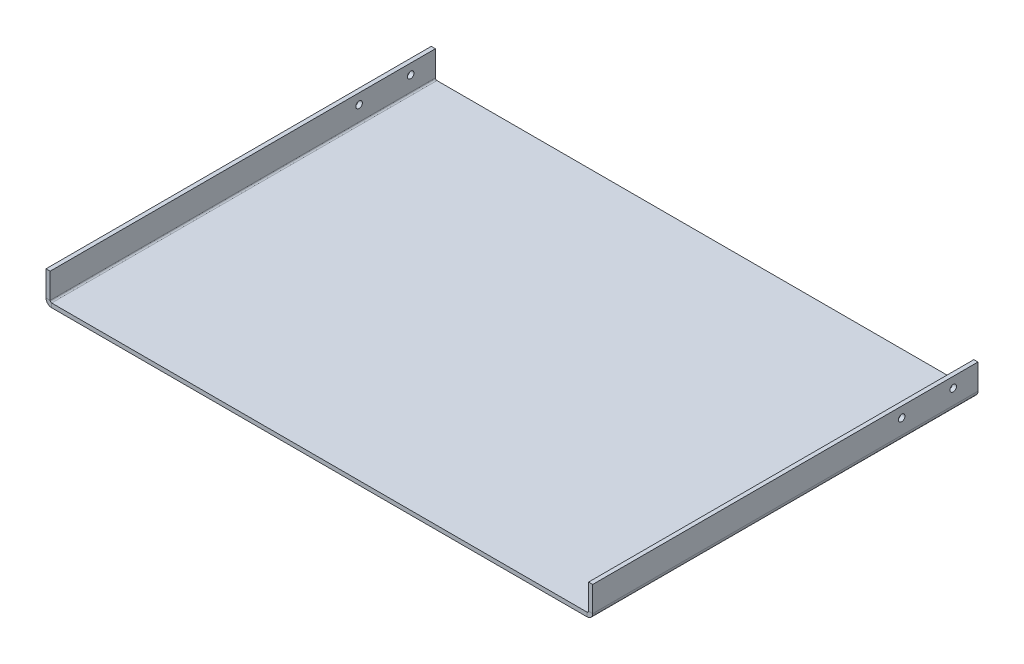
ISO-10303-21;
HEADER;
FILE_DESCRIPTION(('STEP AP214'),'2;1');
FILE_NAME('part.step','',(''),(''),'','','');
FILE_SCHEMA(('AUTOMOTIVE_DESIGN { 1 0 10303 214 1 1 1 1 }'));
ENDSEC;
DATA;
#1=APPLICATION_CONTEXT('core data for automotive mechanical design processes');
#2=APPLICATION_PROTOCOL_DEFINITION('international standard','automotive_design',2000,#1);
#3=PRODUCT_CONTEXT('',#1,'mechanical');
#4=PRODUCT('Part','Part','',(#3));
#5=PRODUCT_RELATED_PRODUCT_CATEGORY('part','',(#4));
#6=PRODUCT_DEFINITION_FORMATION('','',#4);
#7=PRODUCT_DEFINITION_CONTEXT('part definition',#1,'design');
#8=PRODUCT_DEFINITION('design','',#6,#7);
#9=PRODUCT_DEFINITION_SHAPE('','',#8);
#10=(LENGTH_UNIT() NAMED_UNIT(*) SI_UNIT(.MILLI.,.METRE.));
#11=(NAMED_UNIT(*) PLANE_ANGLE_UNIT() SI_UNIT($,.RADIAN.));
#12=(NAMED_UNIT(*) SI_UNIT($,.STERADIAN.) SOLID_ANGLE_UNIT());
#13=UNCERTAINTY_MEASURE_WITH_UNIT(LENGTH_MEASURE(1.E-05),#10,'distance_accuracy_value','');
#14=(GEOMETRIC_REPRESENTATION_CONTEXT(3) GLOBAL_UNCERTAINTY_ASSIGNED_CONTEXT((#13)) GLOBAL_UNIT_ASSIGNED_CONTEXT((#10,
#11,#12)) REPRESENTATION_CONTEXT('',''));
#15=CARTESIAN_POINT('',(0.,0.,0.));
#16=DIRECTION('',(0.,0.,1.));
#17=DIRECTION('',(1.,0.,0.));
#18=AXIS2_PLACEMENT_3D('',#15,#16,#17);
#19=CARTESIAN_POINT('',(0.,-2.,0.));
#20=DIRECTION('',(0.,1.,0.));
#21=DIRECTION('',(0.,0.,1.));
#22=AXIS2_PLACEMENT_3D('',#19,#20,#21);
#23=PLANE('',#22);
#24=DIRECTION('',(0.,0.,-1.));
#25=VECTOR('',#24,1.);
#26=CARTESIAN_POINT('',(38.7674016009762,-2.00000000000001,-31.5017181838341));
#27=LINE('',#26,#25);
#28=CARTESIAN_POINT('',(38.7674016009762,-2.00000000000001,-31.501718183834));
#29=VERTEX_POINT('',#28);
#30=CARTESIAN_POINT('',(38.7674016009762,-2.,155.248281816166));
#31=VERTEX_POINT('',#30);
#32=EDGE_CURVE('E210',#29,#31,#27,.F.);
#33=ORIENTED_EDGE('',*,*,#32,.T.);
#34=DIRECTION('',(1.,0.,0.));
#35=VECTOR('',#34,1.);
#36=CARTESIAN_POINT('',(-223.495998399024,-2.,155.248281816166));
#37=LINE('',#36,#35);
#38=CARTESIAN_POINT('',(-220.759398399024,-2.00000000000002,155.248281816166));
#39=VERTEX_POINT('',#38);
#40=EDGE_CURVE('E86',#39,#31,#37,.T.);
#41=ORIENTED_EDGE('',*,*,#40,.F.);
#42=DIRECTION('',(0.,0.,1.));
#43=VECTOR('',#42,1.);
#44=CARTESIAN_POINT('',(-220.759398399024,-2.00000000000002,155.248281816166));
#45=LINE('',#44,#43);
#46=CARTESIAN_POINT('',(-220.759398399024,-2.,-31.5017181838341));
#47=VERTEX_POINT('',#46);
#48=EDGE_CURVE('E263',#39,#47,#45,.F.);
#49=ORIENTED_EDGE('',*,*,#48,.T.);
#50=DIRECTION('',(-1.,0.,0.));
#51=VECTOR('',#50,1.);
#52=CARTESIAN_POINT('',(-223.495998399024,-2.,-31.5017181838341));
#53=LINE('',#52,#51);
#54=EDGE_CURVE('E13',#29,#47,#53,.T.);
#55=ORIENTED_EDGE('',*,*,#54,.F.);
#56=EDGE_LOOP('',(#33,#41,#49,#55));
#57=FACE_BOUND('',#56,.T.);
#58=ADVANCED_FACE('F77',(#57),#23,.F.);
#59=CARTESIAN_POINT('',(0.,0.,0.));
#60=DIRECTION('',(0.,1.,0.));
#61=DIRECTION('',(0.,0.,1.));
#62=AXIS2_PLACEMENT_3D('',#59,#60,#61);
#63=PLANE('',#62);
#64=DIRECTION('',(1.,0.,0.));
#65=VECTOR('',#64,1.);
#66=CARTESIAN_POINT('',(-223.495998399024,0.,155.248281816166));
#67=LINE('',#66,#65);
#68=CARTESIAN_POINT('',(-220.759398399024,0.,155.248281816166));
#69=VERTEX_POINT('',#68);
#70=CARTESIAN_POINT('',(38.7674016009762,0.,155.248281816166));
#71=VERTEX_POINT('',#70);
#72=EDGE_CURVE('E281',#69,#71,#67,.T.);
#73=ORIENTED_EDGE('',*,*,#72,.T.);
#74=DIRECTION('',(0.,0.,-1.));
#75=VECTOR('',#74,1.);
#76=CARTESIAN_POINT('',(38.7674016009762,0.,-31.5017181838341));
#77=LINE('',#76,#75);
#78=CARTESIAN_POINT('',(38.7674016009762,0.,-31.501718183834));
#79=VERTEX_POINT('',#78);
#80=EDGE_CURVE('E222',#79,#71,#77,.F.);
#81=ORIENTED_EDGE('',*,*,#80,.F.);
#82=DIRECTION('',(-1.,0.,0.));
#83=VECTOR('',#82,1.);
#84=CARTESIAN_POINT('',(-223.495998399024,0.,-31.5017181838341));
#85=LINE('',#84,#83);
#86=CARTESIAN_POINT('',(-220.759398399024,0.,-31.5017181838341));
#87=VERTEX_POINT('',#86);
#88=EDGE_CURVE('E285',#79,#87,#85,.T.);
#89=ORIENTED_EDGE('',*,*,#88,.T.);
#90=DIRECTION('',(0.,0.,1.));
#91=VECTOR('',#90,1.);
#92=CARTESIAN_POINT('',(-220.759398399024,0.,155.248281816166));
#93=LINE('',#92,#91);
#94=EDGE_CURVE('E94',#69,#87,#93,.F.);
#95=ORIENTED_EDGE('',*,*,#94,.F.);
#96=EDGE_LOOP('',(#73,#81,#89,#95));
#97=FACE_BOUND('',#96,.T.);
#98=ADVANCED_FACE('F337',(#97),#63,.T.);
#99=CARTESIAN_POINT('',(-223.495998399024,-2.,-31.5017181838341));
#100=DIRECTION('',(0.,0.,-1.));
#101=DIRECTION('',(-1.,0.,0.));
#102=AXIS2_PLACEMENT_3D('',#99,#100,#101);
#103=PLANE('',#102);
#104=ORIENTED_EDGE('',*,*,#88,.F.);
#105=DIRECTION('',(0.,-1.,0.));
#106=VECTOR('',#105,1.);
#107=CARTESIAN_POINT('',(38.7674016009762,0.,-31.501718183834));
#108=LINE('',#107,#106);
#109=EDGE_CURVE('E216',#79,#29,#108,.T.);
#110=ORIENTED_EDGE('',*,*,#109,.T.);
#111=ORIENTED_EDGE('',*,*,#54,.T.);
#112=DIRECTION('',(0.,-1.,0.));
#113=VECTOR('',#112,1.);
#114=CARTESIAN_POINT('',(-220.759398399024,0.,-31.5017181838341));
#115=LINE('',#114,#113);
#116=EDGE_CURVE('E278',#87,#47,#115,.T.);
#117=ORIENTED_EDGE('',*,*,#116,.F.);
#118=EDGE_LOOP('',(#104,#110,#111,#117));
#119=FACE_BOUND('',#118,.T.);
#120=ADVANCED_FACE('F343',(#119),#103,.T.);
#121=CARTESIAN_POINT('',(-223.495998399024,-2.,155.248281816166));
#122=DIRECTION('',(0.,0.,1.));
#123=DIRECTION('',(1.,0.,0.));
#124=AXIS2_PLACEMENT_3D('',#121,#122,#123);
#125=PLANE('',#124);
#126=DIRECTION('',(0.,-1.,0.));
#127=VECTOR('',#126,1.);
#128=CARTESIAN_POINT('',(38.7674016009762,0.,155.248281816166));
#129=LINE('',#128,#127);
#130=EDGE_CURVE('E228',#71,#31,#129,.T.);
#131=ORIENTED_EDGE('',*,*,#130,.F.);
#132=ORIENTED_EDGE('',*,*,#72,.F.);
#133=DIRECTION('',(0.,-1.,0.));
#134=VECTOR('',#133,1.);
#135=CARTESIAN_POINT('',(-220.759398399024,0.,155.248281816166));
#136=LINE('',#135,#134);
#137=EDGE_CURVE('E269',#69,#39,#136,.T.);
#138=ORIENTED_EDGE('',*,*,#137,.T.);
#139=ORIENTED_EDGE('',*,*,#40,.T.);
#140=EDGE_LOOP('',(#131,#132,#138,#139));
#141=FACE_BOUND('',#140,.T.);
#142=ADVANCED_FACE('F79',(#141),#125,.T.);
#143=CARTESIAN_POINT('',(-220.759398399024,0.736600000000007,-31.5017181838341));
#144=DIRECTION('',(0.,0.,-1.));
#145=DIRECTION('',(-1.,0.,0.));
#146=AXIS2_PLACEMENT_3D('',#143,#144,#145);
#147=PLANE('',#146);
#148=DIRECTION('',(1.,0.,0.));
#149=VECTOR('',#148,1.);
#150=CARTESIAN_POINT('',(-223.495998399024,0.736599999999995,-31.5017181838341));
#151=LINE('',#150,#149);
#152=CARTESIAN_POINT('',(-221.495998399024,0.736600000000004,-31.5017181838341));
#153=VERTEX_POINT('',#152);
#154=CARTESIAN_POINT('',(-223.495998399024,0.736599999999995,-31.5017181838341));
#155=VERTEX_POINT('',#154);
#156=EDGE_CURVE('E231',#153,#155,#151,.F.);
#157=ORIENTED_EDGE('',*,*,#156,.F.);
#158=CARTESIAN_POINT('',(-220.759398399024,0.736600000000007,-31.5017181838341));
#159=DIRECTION('',(0.,0.,1.));
#160=DIRECTION('',(1.,0.,0.));
#161=AXIS2_PLACEMENT_3D('',#158,#159,#160);
#162=CIRCLE('',#161,0.736600000000032);
#163=EDGE_CURVE('E272',#87,#153,#162,.F.);
#164=ORIENTED_EDGE('',*,*,#163,.F.);
#165=ORIENTED_EDGE('',*,*,#116,.T.);
#166=CARTESIAN_POINT('',(-220.759398399024,0.736600000000007,-31.5017181838341));
#167=DIRECTION('',(0.,0.,1.));
#168=DIRECTION('',(1.,0.,0.));
#169=AXIS2_PLACEMENT_3D('',#166,#167,#168);
#170=CIRCLE('',#169,2.73660000000003);
#171=EDGE_CURVE('E265',#47,#155,#170,.F.);
#172=ORIENTED_EDGE('',*,*,#171,.T.);
#173=EDGE_LOOP('',(#157,#164,#165,#172));
#174=FACE_BOUND('',#173,.T.);
#175=ADVANCED_FACE('F352',(#174),#147,.T.);
#176=CARTESIAN_POINT('',(-220.759398399024,0.736600000000007,155.248281816166));
#177=DIRECTION('',(0.,0.,-1.));
#178=DIRECTION('',(-1.,0.,0.));
#179=AXIS2_PLACEMENT_3D('',#176,#177,#178);
#180=PLANE('',#179);
#181=CARTESIAN_POINT('',(-220.759398399024,0.736600000000007,155.248281816166));
#182=DIRECTION('',(0.,0.,1.));
#183=DIRECTION('',(1.,0.,0.));
#184=AXIS2_PLACEMENT_3D('',#181,#182,#183);
#185=CIRCLE('',#184,0.736600000000032);
#186=CARTESIAN_POINT('',(-221.495998399024,0.736600000000004,155.248281816166));
#187=VERTEX_POINT('',#186);
#188=EDGE_CURVE('E236',#187,#69,#185,.T.);
#189=ORIENTED_EDGE('',*,*,#188,.F.);
#190=DIRECTION('',(1.,0.,0.));
#191=VECTOR('',#190,1.);
#192=CARTESIAN_POINT('',(-221.495998399024,0.736600000000004,155.248281816166));
#193=LINE('',#192,#191);
#194=CARTESIAN_POINT('',(-223.495998399024,0.736599999999995,155.248281816166));
#195=VERTEX_POINT('',#194);
#196=EDGE_CURVE('E256',#187,#195,#193,.F.);
#197=ORIENTED_EDGE('',*,*,#196,.T.);
#198=CARTESIAN_POINT('',(-220.759398399024,0.736600000000007,155.248281816166));
#199=DIRECTION('',(0.,0.,1.));
#200=DIRECTION('',(1.,0.,0.));
#201=AXIS2_PLACEMENT_3D('',#198,#199,#200);
#202=CIRCLE('',#201,2.73660000000003);
#203=EDGE_CURVE('E266',#195,#39,#202,.T.);
#204=ORIENTED_EDGE('',*,*,#203,.T.);
#205=ORIENTED_EDGE('',*,*,#137,.F.);
#206=EDGE_LOOP('',(#189,#197,#204,#205));
#207=FACE_BOUND('',#206,.T.);
#208=ADVANCED_FACE('F346',(#207),#180,.F.);
#209=CARTESIAN_POINT('',(-220.759398399024,0.736600000000007,155.248281816166));
#210=DIRECTION('',(0.,0.,1.));
#211=DIRECTION('',(-1.,0.,0.));
#212=AXIS2_PLACEMENT_3D('',#209,#210,#211);
#213=CYLINDRICAL_SURFACE('',#212,2.73660000000003);
#214=ORIENTED_EDGE('',*,*,#48,.F.);
#215=ORIENTED_EDGE('',*,*,#203,.F.);
#216=DIRECTION('',(0.,0.,1.));
#217=VECTOR('',#216,1.);
#218=CARTESIAN_POINT('',(-223.495998399024,0.736599999999995,-31.5017181838341));
#219=LINE('',#218,#217);
#220=EDGE_CURVE('E254',#195,#155,#219,.F.);
#221=ORIENTED_EDGE('',*,*,#220,.T.);
#222=ORIENTED_EDGE('',*,*,#171,.F.);
#223=EDGE_LOOP('',(#214,#215,#221,#222));
#224=FACE_BOUND('',#223,.T.);
#225=ADVANCED_FACE('F367',(#224),#213,.T.);
#226=CARTESIAN_POINT('',(-220.759398399024,0.736600000000007,155.248281816166));
#227=DIRECTION('',(0.,0.,1.));
#228=DIRECTION('',(-1.,0.,0.));
#229=AXIS2_PLACEMENT_3D('',#226,#227,#228);
#230=CYLINDRICAL_SURFACE('',#229,0.736600000000032);
#231=ORIENTED_EDGE('',*,*,#94,.T.);
#232=ORIENTED_EDGE('',*,*,#163,.T.);
#233=DIRECTION('',(0.,0.,1.));
#234=VECTOR('',#233,1.);
#235=CARTESIAN_POINT('',(-221.495998399024,0.736600000000004,-31.5017181838341));
#236=LINE('',#235,#234);
#237=EDGE_CURVE('E259',#153,#187,#236,.T.);
#238=ORIENTED_EDGE('',*,*,#237,.T.);
#239=ORIENTED_EDGE('',*,*,#188,.T.);
#240=EDGE_LOOP('',(#231,#232,#238,#239));
#241=FACE_BOUND('',#240,.T.);
#242=ADVANCED_FACE('F390',(#241),#230,.F.);
#243=CARTESIAN_POINT('',(-223.495998399024,13.,155.248281816166));
#244=DIRECTION('',(0.,0.,-1.));
#245=DIRECTION('',(-1.,0.,0.));
#246=AXIS2_PLACEMENT_3D('',#243,#244,#245);
#247=PLANE('',#246);
#248=ORIENTED_EDGE('',*,*,#196,.F.);
#249=DIRECTION('',(0.,-1.,0.));
#250=VECTOR('',#249,1.);
#251=CARTESIAN_POINT('',(-221.495998399024,13.,155.248281816166));
#252=LINE('',#251,#250);
#253=CARTESIAN_POINT('',(-221.495998399024,13.,155.248281816166));
#254=VERTEX_POINT('',#253);
#255=EDGE_CURVE('E252',#187,#254,#252,.F.);
#256=ORIENTED_EDGE('',*,*,#255,.T.);
#257=DIRECTION('',(1.,0.,0.));
#258=VECTOR('',#257,1.);
#259=CARTESIAN_POINT('',(-223.495998399024,13.,155.248281816166));
#260=LINE('',#259,#258);
#261=CARTESIAN_POINT('',(-223.495998399024,13.,155.248281816166));
#262=VERTEX_POINT('',#261);
#263=EDGE_CURVE('E233',#262,#254,#260,.T.);
#264=ORIENTED_EDGE('',*,*,#263,.F.);
#265=DIRECTION('',(0.,1.,0.));
#266=VECTOR('',#265,1.);
#267=CARTESIAN_POINT('',(-223.495998399024,-9.6133066780916E-13,155.248281816166));
#268=LINE('',#267,#266);
#269=EDGE_CURVE('E245',#195,#262,#268,.T.);
#270=ORIENTED_EDGE('',*,*,#269,.F.);
#271=EDGE_LOOP('',(#248,#256,#264,#270));
#272=FACE_BOUND('',#271,.T.);
#273=ADVANCED_FACE('F377',(#272),#247,.F.);
#274=CARTESIAN_POINT('',(-223.495998399024,0.,-31.5017181838341));
#275=DIRECTION('',(0.,0.,1.));
#276=DIRECTION('',(1.,0.,0.));
#277=AXIS2_PLACEMENT_3D('',#274,#275,#276);
#278=PLANE('',#277);
#279=ORIENTED_EDGE('',*,*,#156,.T.);
#280=DIRECTION('',(0.,-1.,0.));
#281=VECTOR('',#280,1.);
#282=CARTESIAN_POINT('',(-223.495998399024,-9.6133066780916E-13,-31.5017181838341));
#283=LINE('',#282,#281);
#284=CARTESIAN_POINT('',(-223.495998399024,13.,-31.5017181838341));
#285=VERTEX_POINT('',#284);
#286=EDGE_CURVE('E240',#285,#155,#283,.T.);
#287=ORIENTED_EDGE('',*,*,#286,.F.);
#288=DIRECTION('',(1.,0.,0.));
#289=VECTOR('',#288,1.);
#290=CARTESIAN_POINT('',(-223.495998399024,13.,-31.5017181838341));
#291=LINE('',#290,#289);
#292=CARTESIAN_POINT('',(-221.495998399024,13.,-31.5017181838341));
#293=VERTEX_POINT('',#292);
#294=EDGE_CURVE('E237',#285,#293,#291,.T.);
#295=ORIENTED_EDGE('',*,*,#294,.T.);
#296=DIRECTION('',(0.,1.,0.));
#297=VECTOR('',#296,1.);
#298=CARTESIAN_POINT('',(-221.495998399024,0.,-31.5017181838341));
#299=LINE('',#298,#297);
#300=EDGE_CURVE('E247',#293,#153,#299,.F.);
#301=ORIENTED_EDGE('',*,*,#300,.T.);
#302=EDGE_LOOP('',(#279,#287,#295,#301));
#303=FACE_BOUND('',#302,.T.);
#304=ADVANCED_FACE('F385',(#303),#278,.F.);
#305=CARTESIAN_POINT('',(-223.495998399024,-9.6133066780916E-13,0.));
#306=DIRECTION('',(1.,0.,0.));
#307=DIRECTION('',(0.,1.,0.));
#308=AXIS2_PLACEMENT_3D('',#305,#306,#307);
#309=PLANE('',#308);
#310=CARTESIAN_POINT('',(-223.495998399024,8.,-19.5017181838341));
#311=DIRECTION('',(-1.,0.,0.));
#312=DIRECTION('',(0.,-1.,0.));
#313=AXIS2_PLACEMENT_3D('',#310,#311,#312);
#314=CIRCLE('',#313,1.6);
#315=CARTESIAN_POINT('',(-223.495998399024,6.4,-19.5017181838341));
#316=VERTEX_POINT('',#315);
#317=EDGE_CURVE('E291',#316,#316,#314,.T.);
#318=ORIENTED_EDGE('',*,*,#317,.F.);
#319=EDGE_LOOP('',(#318));
#320=FACE_BOUND('',#319,.T.);
#321=CARTESIAN_POINT('',(-223.495998399024,8.,5.49828181616595));
#322=DIRECTION('',(-1.,0.,0.));
#323=DIRECTION('',(0.,-1.,0.));
#324=AXIS2_PLACEMENT_3D('',#321,#322,#323);
#325=CIRCLE('',#324,1.6);
#326=CARTESIAN_POINT('',(-223.495998399024,6.4,5.49828181616595));
#327=VERTEX_POINT('',#326);
#328=EDGE_CURVE('E298',#327,#327,#325,.T.);
#329=ORIENTED_EDGE('',*,*,#328,.F.);
#330=EDGE_LOOP('',(#329));
#331=FACE_BOUND('',#330,.T.);
#332=ORIENTED_EDGE('',*,*,#220,.F.);
#333=ORIENTED_EDGE('',*,*,#269,.T.);
#334=DIRECTION('',(0.,0.,-1.));
#335=VECTOR('',#334,1.);
#336=CARTESIAN_POINT('',(-223.495998399024,13.,0.));
#337=LINE('',#336,#335);
#338=EDGE_CURVE('E243',#262,#285,#337,.T.);
#339=ORIENTED_EDGE('',*,*,#338,.T.);
#340=ORIENTED_EDGE('',*,*,#286,.T.);
#341=EDGE_LOOP('',(#332,#333,#339,#340));
#342=FACE_BOUND('',#341,.T.);
#343=ADVANCED_FACE('F374',(#320,#331,#342),#309,.F.);
#344=CARTESIAN_POINT('',(-221.495998399024,-9.54347705131474E-13,0.));
#345=DIRECTION('',(1.,0.,0.));
#346=DIRECTION('',(0.,1.,0.));
#347=AXIS2_PLACEMENT_3D('',#344,#345,#346);
#348=PLANE('',#347);
#349=CARTESIAN_POINT('',(-221.495998399024,8.00000000000001,-19.5017181838341));
#350=DIRECTION('',(1.,0.,0.));
#351=DIRECTION('',(0.,1.,0.));
#352=AXIS2_PLACEMENT_3D('',#349,#350,#351);
#353=CIRCLE('',#352,1.6);
#354=CARTESIAN_POINT('',(-221.495998399024,9.60000000000001,-19.5017181838341));
#355=VERTEX_POINT('',#354);
#356=EDGE_CURVE('E209',#355,#355,#353,.T.);
#357=ORIENTED_EDGE('',*,*,#356,.F.);
#358=EDGE_LOOP('',(#357));
#359=FACE_BOUND('',#358,.T.);
#360=CARTESIAN_POINT('',(-221.495998399024,8.00000000000001,5.49828181616595));
#361=DIRECTION('',(1.,0.,0.));
#362=DIRECTION('',(0.,1.,0.));
#363=AXIS2_PLACEMENT_3D('',#360,#361,#362);
#364=CIRCLE('',#363,1.6);
#365=CARTESIAN_POINT('',(-221.495998399024,9.60000000000001,5.49828181616595));
#366=VERTEX_POINT('',#365);
#367=EDGE_CURVE('E295',#366,#366,#364,.T.);
#368=ORIENTED_EDGE('',*,*,#367,.F.);
#369=EDGE_LOOP('',(#368));
#370=FACE_BOUND('',#369,.T.);
#371=ORIENTED_EDGE('',*,*,#255,.F.);
#372=ORIENTED_EDGE('',*,*,#237,.F.);
#373=ORIENTED_EDGE('',*,*,#300,.F.);
#374=DIRECTION('',(0.,0.,1.));
#375=VECTOR('',#374,1.);
#376=CARTESIAN_POINT('',(-221.495998399024,13.,-31.5017181838341));
#377=LINE('',#376,#375);
#378=EDGE_CURVE('E250',#254,#293,#377,.F.);
#379=ORIENTED_EDGE('',*,*,#378,.F.);
#380=EDGE_LOOP('',(#371,#372,#373,#379));
#381=FACE_BOUND('',#380,.T.);
#382=ADVANCED_FACE('F392',(#359,#370,#381),#348,.T.);
#383=CARTESIAN_POINT('',(-223.495998399024,13.,-31.5017181838341));
#384=DIRECTION('',(0.,-1.,0.));
#385=DIRECTION('',(1.,0.,0.));
#386=AXIS2_PLACEMENT_3D('',#383,#384,#385);
#387=PLANE('',#386);
#388=ORIENTED_EDGE('',*,*,#378,.T.);
#389=ORIENTED_EDGE('',*,*,#294,.F.);
#390=ORIENTED_EDGE('',*,*,#338,.F.);
#391=ORIENTED_EDGE('',*,*,#263,.T.);
#392=EDGE_LOOP('',(#388,#389,#390,#391));
#393=FACE_BOUND('',#392,.T.);
#394=ADVANCED_FACE('F382',(#393),#387,.F.);
#395=CARTESIAN_POINT('',(38.7674016009762,0.7366,155.248281816166));
#396=DIRECTION('',(0.,0.,1.));
#397=DIRECTION('',(1.,0.,0.));
#398=AXIS2_PLACEMENT_3D('',#395,#396,#397);
#399=PLANE('',#398);
#400=DIRECTION('',(-1.,0.,0.));
#401=VECTOR('',#400,1.);
#402=CARTESIAN_POINT('',(41.5040016009762,0.736599999999989,155.248281816166));
#403=LINE('',#402,#401);
#404=CARTESIAN_POINT('',(39.5040016009762,0.736599999999997,155.248281816166));
#405=VERTEX_POINT('',#404);
#406=CARTESIAN_POINT('',(41.5040016009762,0.736599999999989,155.248281816166));
#407=VERTEX_POINT('',#406);
#408=EDGE_CURVE('E192',#405,#407,#403,.F.);
#409=ORIENTED_EDGE('',*,*,#408,.F.);
#410=CARTESIAN_POINT('',(38.7674016009762,0.7366,155.248281816166));
#411=DIRECTION('',(0.,0.,-1.));
#412=DIRECTION('',(-1.,0.,0.));
#413=AXIS2_PLACEMENT_3D('',#410,#411,#412);
#414=CIRCLE('',#413,0.736600000000011);
#415=EDGE_CURVE('E219',#71,#405,#414,.F.);
#416=ORIENTED_EDGE('',*,*,#415,.F.);
#417=ORIENTED_EDGE('',*,*,#130,.T.);
#418=CARTESIAN_POINT('',(38.7674016009762,0.7366,155.248281816166));
#419=DIRECTION('',(0.,0.,-1.));
#420=DIRECTION('',(-1.,0.,0.));
#421=AXIS2_PLACEMENT_3D('',#418,#419,#420);
#422=CIRCLE('',#421,2.73660000000001);
#423=EDGE_CURVE('E212',#31,#407,#422,.F.);
#424=ORIENTED_EDGE('',*,*,#423,.T.);
#425=EDGE_LOOP('',(#409,#416,#417,#424));
#426=FACE_BOUND('',#425,.T.);
#427=ADVANCED_FACE('F357',(#426),#399,.T.);
#428=CARTESIAN_POINT('',(38.7674016009762,0.7366,-31.501718183834));
#429=DIRECTION('',(0.,0.,1.));
#430=DIRECTION('',(1.,0.,0.));
#431=AXIS2_PLACEMENT_3D('',#428,#429,#430);
#432=PLANE('',#431);
#433=CARTESIAN_POINT('',(38.7674016009762,0.7366,-31.501718183834));
#434=DIRECTION('',(0.,0.,-1.));
#435=DIRECTION('',(-1.,0.,0.));
#436=AXIS2_PLACEMENT_3D('',#433,#434,#435);
#437=CIRCLE('',#436,0.736600000000011);
#438=CARTESIAN_POINT('',(39.5040016009762,0.736599999999997,-31.501718183834));
#439=VERTEX_POINT('',#438);
#440=EDGE_CURVE('E225',#439,#79,#437,.T.);
#441=ORIENTED_EDGE('',*,*,#440,.F.);
#442=DIRECTION('',(-1.,0.,0.));
#443=VECTOR('',#442,1.);
#444=CARTESIAN_POINT('',(39.5040016009762,0.736599999999997,-31.501718183834));
#445=LINE('',#444,#443);
#446=CARTESIAN_POINT('',(41.5040016009762,0.736599999999989,-31.5017181838341));
#447=VERTEX_POINT('',#446);
#448=EDGE_CURVE('E203',#439,#447,#445,.F.);
#449=ORIENTED_EDGE('',*,*,#448,.T.);
#450=CARTESIAN_POINT('',(38.7674016009762,0.7366,-31.501718183834));
#451=DIRECTION('',(0.,0.,-1.));
#452=DIRECTION('',(-1.,0.,0.));
#453=AXIS2_PLACEMENT_3D('',#450,#451,#452);
#454=CIRCLE('',#453,2.73660000000001);
#455=EDGE_CURVE('E213',#447,#29,#454,.T.);
#456=ORIENTED_EDGE('',*,*,#455,.T.);
#457=ORIENTED_EDGE('',*,*,#109,.F.);
#458=EDGE_LOOP('',(#441,#449,#456,#457));
#459=FACE_BOUND('',#458,.T.);
#460=ADVANCED_FACE('F324',(#459),#432,.F.);
#461=CARTESIAN_POINT('',(38.7674016009762,0.7366,-31.5017181838341));
#462=DIRECTION('',(0.,0.,-1.));
#463=DIRECTION('',(1.,0.,0.));
#464=AXIS2_PLACEMENT_3D('',#461,#462,#463);
#465=CYLINDRICAL_SURFACE('',#464,2.73660000000001);
#466=ORIENTED_EDGE('',*,*,#32,.F.);
#467=ORIENTED_EDGE('',*,*,#455,.F.);
#468=DIRECTION('',(0.,0.,-1.));
#469=VECTOR('',#468,1.);
#470=CARTESIAN_POINT('',(41.5040016009762,0.736599999999989,155.248281816166));
#471=LINE('',#470,#469);
#472=EDGE_CURVE('E201',#447,#407,#471,.F.);
#473=ORIENTED_EDGE('',*,*,#472,.T.);
#474=ORIENTED_EDGE('',*,*,#423,.F.);
#475=EDGE_LOOP('',(#466,#467,#473,#474));
#476=FACE_BOUND('',#475,.T.);
#477=ADVANCED_FACE('F360',(#476),#465,.T.);
#478=CARTESIAN_POINT('',(38.7674016009762,0.7366,-31.5017181838341));
#479=DIRECTION('',(0.,0.,-1.));
#480=DIRECTION('',(1.,0.,0.));
#481=AXIS2_PLACEMENT_3D('',#478,#479,#480);
#482=CYLINDRICAL_SURFACE('',#481,0.736600000000011);
#483=ORIENTED_EDGE('',*,*,#80,.T.);
#484=ORIENTED_EDGE('',*,*,#415,.T.);
#485=DIRECTION('',(0.,0.,-1.));
#486=VECTOR('',#485,1.);
#487=CARTESIAN_POINT('',(39.5040016009762,0.736599999999997,155.248281816166));
#488=LINE('',#487,#486);
#489=EDGE_CURVE('E206',#405,#439,#488,.T.);
#490=ORIENTED_EDGE('',*,*,#489,.T.);
#491=ORIENTED_EDGE('',*,*,#440,.T.);
#492=EDGE_LOOP('',(#483,#484,#490,#491));
#493=FACE_BOUND('',#492,.T.);
#494=ADVANCED_FACE('F319',(#493),#482,.F.);
#495=CARTESIAN_POINT('',(41.5040016009762,0.,155.248281816166));
#496=DIRECTION('',(0.,0.,-1.));
#497=DIRECTION('',(-1.,0.,0.));
#498=AXIS2_PLACEMENT_3D('',#495,#496,#497);
#499=PLANE('',#498);
#500=ORIENTED_EDGE('',*,*,#408,.T.);
#501=DIRECTION('',(0.,-1.,0.));
#502=VECTOR('',#501,1.);
#503=CARTESIAN_POINT('',(41.5040016009762,-1.62055504668255E-13,155.248281816166));
#504=LINE('',#503,#502);
#505=CARTESIAN_POINT('',(41.5040016009763,13.,155.248281816166));
#506=VERTEX_POINT('',#505);
#507=EDGE_CURVE('E173',#506,#407,#504,.T.);
#508=ORIENTED_EDGE('',*,*,#507,.F.);
#509=DIRECTION('',(-1.,0.,0.));
#510=VECTOR('',#509,1.);
#511=CARTESIAN_POINT('',(41.5040016009763,13.,155.248281816166));
#512=LINE('',#511,#510);
#513=CARTESIAN_POINT('',(39.5040016009763,13.,155.248281816166));
#514=VERTEX_POINT('',#513);
#515=EDGE_CURVE('E179',#506,#514,#512,.T.);
#516=ORIENTED_EDGE('',*,*,#515,.T.);
#517=DIRECTION('',(0.,1.,0.));
#518=VECTOR('',#517,1.);
#519=CARTESIAN_POINT('',(39.5040016009762,0.,155.248281816166));
#520=LINE('',#519,#518);
#521=EDGE_CURVE('E199',#514,#405,#520,.F.);
#522=ORIENTED_EDGE('',*,*,#521,.T.);
#523=EDGE_LOOP('',(#500,#508,#516,#522));
#524=FACE_BOUND('',#523,.T.);
#525=ADVANCED_FACE('F191',(#524),#499,.F.);
#526=CARTESIAN_POINT('',(41.5040016009762,13.,-31.5017181838341));
#527=DIRECTION('',(0.,0.,1.));
#528=DIRECTION('',(0.,-1.,0.));
#529=AXIS2_PLACEMENT_3D('',#526,#527,#528);
#530=PLANE('',#529);
#531=ORIENTED_EDGE('',*,*,#448,.F.);
#532=DIRECTION('',(0.,-1.,0.));
#533=VECTOR('',#532,1.);
#534=CARTESIAN_POINT('',(39.5040016009762,13.,-31.5017181838341));
#535=LINE('',#534,#533);
#536=CARTESIAN_POINT('',(39.5040016009762,13.,-31.501718183834));
#537=VERTEX_POINT('',#536);
#538=EDGE_CURVE('E195',#439,#537,#535,.F.);
#539=ORIENTED_EDGE('',*,*,#538,.T.);
#540=DIRECTION('',(-1.,0.,0.));
#541=VECTOR('',#540,1.);
#542=CARTESIAN_POINT('',(41.5040016009762,13.,-31.501718183834));
#543=LINE('',#542,#541);
#544=CARTESIAN_POINT('',(41.5040016009762,13.,-31.501718183834));
#545=VERTEX_POINT('',#544);
#546=EDGE_CURVE('E188',#545,#537,#543,.T.);
#547=ORIENTED_EDGE('',*,*,#546,.F.);
#548=DIRECTION('',(0.,1.,0.));
#549=VECTOR('',#548,1.);
#550=CARTESIAN_POINT('',(41.5040016009762,-1.45241113878377E-13,-31.5017181838341));
#551=LINE('',#550,#549);
#552=EDGE_CURVE('E175',#447,#545,#551,.T.);
#553=ORIENTED_EDGE('',*,*,#552,.F.);
#554=EDGE_LOOP('',(#531,#539,#547,#553));
#555=FACE_BOUND('',#554,.T.);
#556=ADVANCED_FACE('F325',(#555),#530,.F.);
#557=CARTESIAN_POINT('',(41.5040016009762,-1.62055504668254E-13,0.));
#558=DIRECTION('',(-1.,0.,0.));
#559=DIRECTION('',(0.,-1.,0.));
#560=AXIS2_PLACEMENT_3D('',#557,#558,#559);
#561=PLANE('',#560);
#562=CARTESIAN_POINT('',(41.5040016009762,8.00000000000113,-19.5017181838341));
#563=DIRECTION('',(-1.,0.,0.));
#564=DIRECTION('',(0.,-1.,0.));
#565=AXIS2_PLACEMENT_3D('',#562,#563,#564);
#566=CIRCLE('',#565,1.6);
#567=CARTESIAN_POINT('',(41.5040016009762,6.40000000000113,-19.5017181838341));
#568=VERTEX_POINT('',#567);
#569=EDGE_CURVE('E307',#568,#568,#566,.T.);
#570=ORIENTED_EDGE('',*,*,#569,.T.);
#571=EDGE_LOOP('',(#570));
#572=FACE_BOUND('',#571,.T.);
#573=CARTESIAN_POINT('',(41.5040016009762,8.00000000000113,5.49828181616587));
#574=DIRECTION('',(-1.,0.,0.));
#575=DIRECTION('',(0.,-1.,0.));
#576=AXIS2_PLACEMENT_3D('',#573,#574,#575);
#577=CIRCLE('',#576,1.6);
#578=CARTESIAN_POINT('',(41.5040016009762,6.40000000000113,5.49828181616587));
#579=VERTEX_POINT('',#578);
#580=EDGE_CURVE('E290',#579,#579,#577,.T.);
#581=ORIENTED_EDGE('',*,*,#580,.T.);
#582=EDGE_LOOP('',(#581));
#583=FACE_BOUND('',#582,.T.);
#584=ORIENTED_EDGE('',*,*,#472,.F.);
#585=ORIENTED_EDGE('',*,*,#552,.T.);
#586=DIRECTION('',(0.,0.,1.));
#587=VECTOR('',#586,1.);
#588=CARTESIAN_POINT('',(41.5040016009763,13.,0.));
#589=LINE('',#588,#587);
#590=EDGE_CURVE('E168',#545,#506,#589,.T.);
#591=ORIENTED_EDGE('',*,*,#590,.T.);
#592=ORIENTED_EDGE('',*,*,#507,.T.);
#593=EDGE_LOOP('',(#584,#585,#591,#592));
#594=FACE_BOUND('',#593,.T.);
#595=ADVANCED_FACE('F171',(#572,#583,#594),#561,.F.);
#596=CARTESIAN_POINT('',(39.5040016009762,-1.55072541990568E-13,0.));
#597=DIRECTION('',(-1.,0.,0.));
#598=DIRECTION('',(0.,-1.,0.));
#599=AXIS2_PLACEMENT_3D('',#596,#597,#598);
#600=PLANE('',#599);
#601=CARTESIAN_POINT('',(39.5040016009762,8.00000000000112,-19.5017181838341));
#602=DIRECTION('',(-1.,0.,0.));
#603=DIRECTION('',(0.,-1.,0.));
#604=AXIS2_PLACEMENT_3D('',#601,#602,#603);
#605=CIRCLE('',#604,1.6);
#606=CARTESIAN_POINT('',(39.5040016009762,6.40000000000112,-19.5017181838341));
#607=VERTEX_POINT('',#606);
#608=EDGE_CURVE('E81',#607,#607,#605,.T.);
#609=ORIENTED_EDGE('',*,*,#608,.F.);
#610=EDGE_LOOP('',(#609));
#611=FACE_BOUND('',#610,.T.);
#612=CARTESIAN_POINT('',(39.5040016009762,8.00000000000112,5.49828181616587));
#613=DIRECTION('',(-1.,0.,0.));
#614=DIRECTION('',(0.,-1.,0.));
#615=AXIS2_PLACEMENT_3D('',#612,#613,#614);
#616=CIRCLE('',#615,1.6);
#617=CARTESIAN_POINT('',(39.5040016009762,6.40000000000112,5.49828181616587));
#618=VERTEX_POINT('',#617);
#619=EDGE_CURVE('E288',#618,#618,#616,.T.);
#620=ORIENTED_EDGE('',*,*,#619,.F.);
#621=EDGE_LOOP('',(#620));
#622=FACE_BOUND('',#621,.T.);
#623=ORIENTED_EDGE('',*,*,#538,.F.);
#624=ORIENTED_EDGE('',*,*,#489,.F.);
#625=ORIENTED_EDGE('',*,*,#521,.F.);
#626=DIRECTION('',(0.,0.,-1.));
#627=VECTOR('',#626,1.);
#628=CARTESIAN_POINT('',(39.5040016009763,13.,155.248281816166));
#629=LINE('',#628,#627);
#630=EDGE_CURVE('E184',#537,#514,#629,.F.);
#631=ORIENTED_EDGE('',*,*,#630,.F.);
#632=EDGE_LOOP('',(#623,#624,#625,#631));
#633=FACE_BOUND('',#632,.T.);
#634=ADVANCED_FACE('F315',(#611,#622,#633),#600,.T.);
#635=CARTESIAN_POINT('',(41.5040016009763,13.,155.248281816166));
#636=DIRECTION('',(0.,-1.,0.));
#637=DIRECTION('',(1.,0.,0.));
#638=AXIS2_PLACEMENT_3D('',#635,#636,#637);
#639=PLANE('',#638);
#640=ORIENTED_EDGE('',*,*,#630,.T.);
#641=ORIENTED_EDGE('',*,*,#515,.F.);
#642=ORIENTED_EDGE('',*,*,#590,.F.);
#643=ORIENTED_EDGE('',*,*,#546,.T.);
#644=EDGE_LOOP('',(#640,#641,#642,#643));
#645=FACE_BOUND('',#644,.T.);
#646=ADVANCED_FACE('F182',(#645),#639,.F.);
#647=CARTESIAN_POINT('',(57.5040016009762,8.0000000000012,5.49828181616587));
#648=DIRECTION('',(-1.,0.,0.));
#649=DIRECTION('',(0.,-1.,0.));
#650=AXIS2_PLACEMENT_3D('',#647,#648,#649);
#651=CYLINDRICAL_SURFACE('',#650,1.6);
#652=ORIENTED_EDGE('',*,*,#619,.T.);
#653=EDGE_LOOP('',(#652));
#654=FACE_BOUND('',#653,.T.);
#655=ORIENTED_EDGE('',*,*,#580,.F.);
#656=EDGE_LOOP('',(#655));
#657=FACE_BOUND('',#656,.T.);
#658=ADVANCED_FACE('F475',(#654,#657),#651,.F.);
#659=CARTESIAN_POINT('',(57.5040016009762,8.0000000000012,-19.5017181838341));
#660=DIRECTION('',(-1.,0.,0.));
#661=DIRECTION('',(0.,-1.,0.));
#662=AXIS2_PLACEMENT_3D('',#659,#660,#661);
#663=CYLINDRICAL_SURFACE('',#662,1.6);
#664=ORIENTED_EDGE('',*,*,#608,.T.);
#665=EDGE_LOOP('',(#664));
#666=FACE_BOUND('',#665,.T.);
#667=ORIENTED_EDGE('',*,*,#569,.F.);
#668=EDGE_LOOP('',(#667));
#669=FACE_BOUND('',#668,.T.);
#670=ADVANCED_FACE('F480',(#666,#669),#663,.F.);
#671=ORIENTED_EDGE('',*,*,#367,.T.);
#672=EDGE_LOOP('',(#671));
#673=FACE_BOUND('',#672,.T.);
#674=ORIENTED_EDGE('',*,*,#328,.T.);
#675=EDGE_LOOP('',(#674));
#676=FACE_BOUND('',#675,.T.);
#677=ADVANCED_FACE('F482',(#673,#676),#651,.F.);
#678=ORIENTED_EDGE('',*,*,#356,.T.);
#679=EDGE_LOOP('',(#678));
#680=FACE_BOUND('',#679,.T.);
#681=ORIENTED_EDGE('',*,*,#317,.T.);
#682=EDGE_LOOP('',(#681));
#683=FACE_BOUND('',#682,.T.);
#684=ADVANCED_FACE('F493',(#680,#683),#663,.F.);
#685=CLOSED_SHELL('',(#58,#98,#120,#142,#175,#208,#225,#242,#273,#304,#343,#382,#394,#427,#460,
#477,#494,#525,#556,#595,#634,#646,#658,#670,#677,#684));
#686=MANIFOLD_SOLID_BREP('B2',#685);
#687=ADVANCED_BREP_SHAPE_REPRESENTATION('',(#18,#686),#14);
#688=SHAPE_DEFINITION_REPRESENTATION(#9,#687);
ENDSEC;
END-ISO-10303-21;
